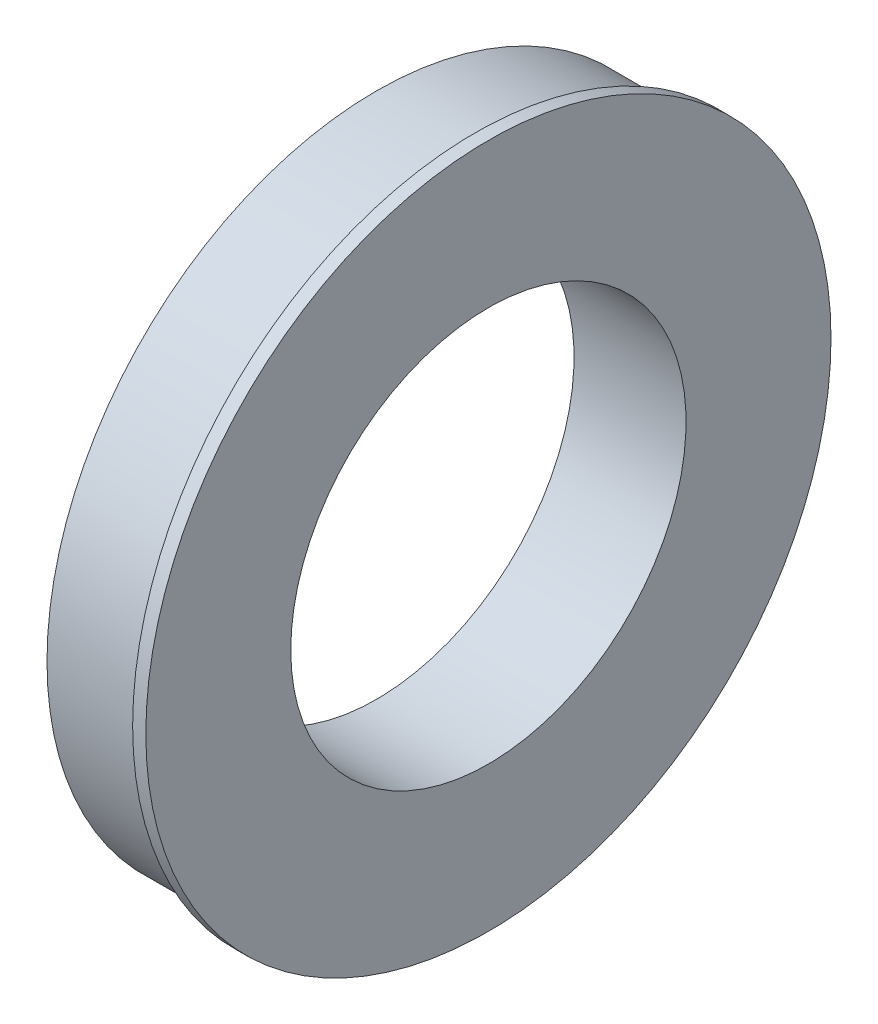
ISO-10303-21;
HEADER;
FILE_DESCRIPTION(('STEP AP214'),'2;1');
FILE_NAME('part.step','',(''),(''),'','','');
FILE_SCHEMA(('AUTOMOTIVE_DESIGN { 1 0 10303 214 1 1 1 1 }'));
ENDSEC;
DATA;
#1=APPLICATION_CONTEXT('core data for automotive mechanical design processes');
#2=APPLICATION_PROTOCOL_DEFINITION('international standard','automotive_design',2000,#1);
#3=PRODUCT_CONTEXT('',#1,'mechanical');
#4=PRODUCT('Part','Part','',(#3));
#5=PRODUCT_RELATED_PRODUCT_CATEGORY('part','',(#4));
#6=PRODUCT_DEFINITION_FORMATION('','',#4);
#7=PRODUCT_DEFINITION_CONTEXT('part definition',#1,'design');
#8=PRODUCT_DEFINITION('design','',#6,#7);
#9=PRODUCT_DEFINITION_SHAPE('','',#8);
#10=(LENGTH_UNIT() NAMED_UNIT(*) SI_UNIT(.MILLI.,.METRE.));
#11=(NAMED_UNIT(*) PLANE_ANGLE_UNIT() SI_UNIT($,.RADIAN.));
#12=(NAMED_UNIT(*) SI_UNIT($,.STERADIAN.) SOLID_ANGLE_UNIT());
#13=UNCERTAINTY_MEASURE_WITH_UNIT(LENGTH_MEASURE(1.E-05),#10,'distance_accuracy_value','');
#14=(GEOMETRIC_REPRESENTATION_CONTEXT(3) GLOBAL_UNCERTAINTY_ASSIGNED_CONTEXT((#13)) GLOBAL_UNIT_ASSIGNED_CONTEXT((#10,
#11,#12)) REPRESENTATION_CONTEXT('',''));
#15=CARTESIAN_POINT('',(0.,0.,0.));
#16=DIRECTION('',(0.,0.,1.));
#17=DIRECTION('',(1.,0.,0.));
#18=AXIS2_PLACEMENT_3D('',#15,#16,#17);
#19=CARTESIAN_POINT('',(5.25485309950739,0.,0.));
#20=DIRECTION('',(1.,0.,0.));
#21=DIRECTION('',(0.,0.,-1.));
#22=AXIS2_PLACEMENT_3D('',#19,#20,#21);
#23=PLANE('',#22);
#24=CARTESIAN_POINT('',(5.25485309950739,0.,0.));
#25=DIRECTION('',(1.,0.,0.));
#26=DIRECTION('',(0.,0.,-1.));
#27=AXIS2_PLACEMENT_3D('',#24,#25,#26);
#28=CIRCLE('',#27,32.98698);
#29=CARTESIAN_POINT('',(5.25485309950739,0.,32.98698));
#30=VERTEX_POINT('',#29);
#31=EDGE_CURVE('E40',#30,#30,#28,.T.);
#32=ORIENTED_EDGE('',*,*,#31,.F.);
#33=EDGE_LOOP('',(#32));
#34=FACE_BOUND('',#33,.T.);
#35=CARTESIAN_POINT('',(5.25485309950739,0.,0.));
#36=DIRECTION('',(1.,0.,0.));
#37=DIRECTION('',(0.,0.,-1.));
#38=AXIS2_PLACEMENT_3D('',#35,#36,#37);
#39=CIRCLE('',#38,19.792188);
#40=CARTESIAN_POINT('',(5.25485309950739,0.,19.792188));
#41=VERTEX_POINT('',#40);
#42=EDGE_CURVE('E49',#41,#41,#39,.T.);
#43=ORIENTED_EDGE('',*,*,#42,.T.);
#44=EDGE_LOOP('',(#43));
#45=FACE_BOUND('',#44,.T.);
#46=ADVANCED_FACE('F36',(#34,#45),#23,.F.);
#47=CARTESIAN_POINT('',(15.1509470995074,0.,0.));
#48=DIRECTION('',(-1.,0.,0.));
#49=DIRECTION('',(0.,0.,1.));
#50=AXIS2_PLACEMENT_3D('',#47,#48,#49);
#51=CYLINDRICAL_SURFACE('',#50,32.98698);
#52=CARTESIAN_POINT('',(15.1509470995074,0.,0.));
#53=DIRECTION('',(1.,0.,0.));
#54=DIRECTION('',(0.,0.,-1.));
#55=AXIS2_PLACEMENT_3D('',#52,#53,#54);
#56=CIRCLE('',#55,32.98698);
#57=CARTESIAN_POINT('',(15.1509470995074,0.,32.98698));
#58=VERTEX_POINT('',#57);
#59=EDGE_CURVE('E10',#58,#58,#56,.T.);
#60=CARTESIAN_POINT('',(15.1509470995074,0.,32.98698));
#61=CARTESIAN_POINT('',(15.0478627870074,0.,32.98698));
#62=CARTESIAN_POINT('',(14.9447784745074,0.,32.98698));
#63=CARTESIAN_POINT('',(14.7386098495074,0.,32.98698));
#64=CARTESIAN_POINT('',(14.6355255370074,0.,32.98698));
#65=CARTESIAN_POINT('',(14.4293569120074,0.,32.98698));
#66=CARTESIAN_POINT('',(14.3262725995074,0.,32.98698));
#67=CARTESIAN_POINT('',(14.1201039745074,0.,32.98698));
#68=CARTESIAN_POINT('',(14.0170196620074,0.,32.98698));
#69=CARTESIAN_POINT('',(13.8108510370074,0.,32.98698));
#70=CARTESIAN_POINT('',(13.7077667245074,0.,32.98698));
#71=CARTESIAN_POINT('',(13.5015980995074,0.,32.98698));
#72=CARTESIAN_POINT('',(13.3985137870074,0.,32.98698));
#73=CARTESIAN_POINT('',(13.1923451620074,0.,32.98698));
#74=CARTESIAN_POINT('',(13.0892608495074,0.,32.98698));
#75=CARTESIAN_POINT('',(12.8830922245074,0.,32.98698));
#76=CARTESIAN_POINT('',(12.7800079120074,0.,32.98698));
#77=CARTESIAN_POINT('',(12.5738392870074,0.,32.98698));
#78=CARTESIAN_POINT('',(12.4707549745074,0.,32.98698));
#79=CARTESIAN_POINT('',(12.2645863495074,0.,32.98698));
#80=CARTESIAN_POINT('',(12.1615020370074,0.,32.98698));
#81=CARTESIAN_POINT('',(11.9553334120074,0.,32.98698));
#82=CARTESIAN_POINT('',(11.8522490995074,0.,32.98698));
#83=CARTESIAN_POINT('',(11.6460804745074,0.,32.98698));
#84=CARTESIAN_POINT('',(11.5429961620074,0.,32.98698));
#85=CARTESIAN_POINT('',(11.3368275370074,0.,32.98698));
#86=CARTESIAN_POINT('',(11.2337432245074,0.,32.98698));
#87=CARTESIAN_POINT('',(11.0275745995074,0.,32.98698));
#88=CARTESIAN_POINT('',(10.9244902870074,0.,32.98698));
#89=CARTESIAN_POINT('',(10.7183216620074,0.,32.98698));
#90=CARTESIAN_POINT('',(10.6152373495074,0.,32.98698));
#91=CARTESIAN_POINT('',(10.4090687245074,0.,32.98698));
#92=CARTESIAN_POINT('',(10.3059844120074,0.,32.98698));
#93=CARTESIAN_POINT('',(10.0998157870074,0.,32.98698));
#94=CARTESIAN_POINT('',(9.99673147450739,0.,32.98698));
#95=CARTESIAN_POINT('',(9.79056284950739,0.,32.98698));
#96=CARTESIAN_POINT('',(9.68747853700739,0.,32.98698));
#97=CARTESIAN_POINT('',(9.48130991200739,0.,32.98698));
#98=CARTESIAN_POINT('',(9.37822559950739,0.,32.98698));
#99=CARTESIAN_POINT('',(9.17205697450739,0.,32.98698));
#100=CARTESIAN_POINT('',(9.06897266200739,0.,32.98698));
#101=CARTESIAN_POINT('',(8.86280403700739,0.,32.98698));
#102=CARTESIAN_POINT('',(8.75971972450739,0.,32.98698));
#103=CARTESIAN_POINT('',(8.55355109950739,0.,32.98698));
#104=CARTESIAN_POINT('',(8.45046678700739,0.,32.98698));
#105=CARTESIAN_POINT('',(8.24429816200739,0.,32.98698));
#106=CARTESIAN_POINT('',(8.14121384950739,0.,32.98698));
#107=CARTESIAN_POINT('',(7.93504522450739,0.,32.98698));
#108=CARTESIAN_POINT('',(7.83196091200739,0.,32.98698));
#109=CARTESIAN_POINT('',(7.62579228700739,0.,32.98698));
#110=CARTESIAN_POINT('',(7.52270797450739,0.,32.98698));
#111=CARTESIAN_POINT('',(7.31653934950739,0.,32.98698));
#112=CARTESIAN_POINT('',(7.21345503700739,0.,32.98698));
#113=CARTESIAN_POINT('',(7.00728641200739,0.,32.98698));
#114=CARTESIAN_POINT('',(6.90420209950739,0.,32.98698));
#115=CARTESIAN_POINT('',(6.69803347450739,0.,32.98698));
#116=CARTESIAN_POINT('',(6.59494916200739,0.,32.98698));
#117=CARTESIAN_POINT('',(6.38878053700739,0.,32.98698));
#118=CARTESIAN_POINT('',(6.28569622450739,0.,32.98698));
#119=CARTESIAN_POINT('',(6.07952759950739,0.,32.98698));
#120=CARTESIAN_POINT('',(5.97644328700739,0.,32.98698));
#121=CARTESIAN_POINT('',(5.77027466200739,0.,32.98698));
#122=CARTESIAN_POINT('',(5.66719034950739,0.,32.98698));
#123=CARTESIAN_POINT('',(5.46102172450739,0.,32.98698));
#124=CARTESIAN_POINT('',(5.35793741200739,0.,32.98698));
#125=CARTESIAN_POINT('',(5.25485309950739,0.,32.98698));
#126=B_SPLINE_CURVE_WITH_KNOTS('',3,(#60,#61,#62,#63,#64,#65,#66,#67,#68,#69,#70,#71,#72,#73,
#74,#75,#76,#77,#78,#79,#80,#81,#82,#83,#84,#85,#86,#87,#88,#89,#90,#91,#92,#93,#94,#95,#96,#97,
#98,#99,#100,#101,#102,#103,#104,#105,#106,#107,#108,#109,#110,#111,#112,#113,#114,#115,#116,
#117,#118,#119,#120,#121,#122,#123,#124,#125),.UNSPECIFIED.,.F.,.F.,(4,2,2,2,2,2,2,2,2,2,2,2,2,
2,2,2,2,2,2,2,2,2,2,2,2,2,2,2,2,2,2,2,4),(0.,0.309252937500001,0.618505875000001,
0.927758812500002,1.23701175,1.5462646875,1.855517625,2.1647705625,2.4740235,2.7832764375,
3.092529375,3.4017823125,3.71103525,4.0202881875,4.329541125,4.6387940625,4.948047,5.2572999375,
5.566552875,5.8758058125,6.18505875,6.4943116875,6.803564625,7.1128175625,7.4220705,
7.7313234375,8.040576375,8.3498293125,8.65908225,8.9683351875,9.277588125,9.5868410625,
9.896094),.UNSPECIFIED.);
#127=EDGE_CURVE('BSEAM38',#58,#30,#126,.T.);
#128=ORIENTED_EDGE('',*,*,#59,.F.);
#129=ORIENTED_EDGE('',*,*,#31,.T.);
#130=ORIENTED_EDGE('',*,*,#127,.T.);
#131=ORIENTED_EDGE('',*,*,#127,.F.);
#132=EDGE_LOOP('',(#128,#130,#129,#131));
#133=FACE_BOUND('',#132,.T.);
#134=ADVANCED_FACE('F38',(#133),#51,.T.);
#135=CARTESIAN_POINT('',(15.1509470995074,0.,0.));
#136=DIRECTION('',(-1.,0.,0.));
#137=DIRECTION('',(0.,0.,1.));
#138=AXIS2_PLACEMENT_3D('',#135,#136,#137);
#139=CYLINDRICAL_SURFACE('',#138,19.792188);
#140=CARTESIAN_POINT('',(16.4704262995074,0.,0.));
#141=DIRECTION('',(1.,0.,0.));
#142=DIRECTION('',(0.,0.,-1.));
#143=AXIS2_PLACEMENT_3D('',#140,#141,#142);
#144=CIRCLE('',#143,19.792188);
#145=CARTESIAN_POINT('',(16.4704262995074,0.,19.792188));
#146=VERTEX_POINT('',#145);
#147=EDGE_CURVE('E59',#146,#146,#144,.T.);
#148=CARTESIAN_POINT('',(5.25485309950739,0.,19.792188));
#149=CARTESIAN_POINT('',(5.37168198700739,0.,19.792188));
#150=CARTESIAN_POINT('',(5.48851087450739,0.,19.792188));
#151=CARTESIAN_POINT('',(5.72216864950739,0.,19.792188));
#152=CARTESIAN_POINT('',(5.83899753700739,0.,19.792188));
#153=CARTESIAN_POINT('',(6.07265531200739,0.,19.792188));
#154=CARTESIAN_POINT('',(6.18948419950739,0.,19.792188));
#155=CARTESIAN_POINT('',(6.42314197450739,0.,19.792188));
#156=CARTESIAN_POINT('',(6.53997086200739,0.,19.792188));
#157=CARTESIAN_POINT('',(6.77362863700739,0.,19.792188));
#158=CARTESIAN_POINT('',(6.89045752450739,0.,19.792188));
#159=CARTESIAN_POINT('',(7.12411529950739,0.,19.792188));
#160=CARTESIAN_POINT('',(7.24094418700739,0.,19.792188));
#161=CARTESIAN_POINT('',(7.47460196200739,0.,19.792188));
#162=CARTESIAN_POINT('',(7.59143084950739,0.,19.792188));
#163=CARTESIAN_POINT('',(7.82508862450739,0.,19.792188));
#164=CARTESIAN_POINT('',(7.94191751200739,0.,19.792188));
#165=CARTESIAN_POINT('',(8.17557528700739,0.,19.792188));
#166=CARTESIAN_POINT('',(8.29240417450739,0.,19.792188));
#167=CARTESIAN_POINT('',(8.52606194950739,0.,19.792188));
#168=CARTESIAN_POINT('',(8.64289083700739,0.,19.792188));
#169=CARTESIAN_POINT('',(8.87654861200739,0.,19.792188));
#170=CARTESIAN_POINT('',(8.99337749950739,0.,19.792188));
#171=CARTESIAN_POINT('',(9.22703527450739,0.,19.792188));
#172=CARTESIAN_POINT('',(9.34386416200739,0.,19.792188));
#173=CARTESIAN_POINT('',(9.57752193700739,0.,19.792188));
#174=CARTESIAN_POINT('',(9.69435082450739,0.,19.792188));
#175=CARTESIAN_POINT('',(9.92800859950739,0.,19.792188));
#176=CARTESIAN_POINT('',(10.0448374870074,0.,19.792188));
#177=CARTESIAN_POINT('',(10.2784952620074,0.,19.792188));
#178=CARTESIAN_POINT('',(10.3953241495074,0.,19.792188));
#179=CARTESIAN_POINT('',(10.6289819245074,0.,19.792188));
#180=CARTESIAN_POINT('',(10.7458108120074,0.,19.792188));
#181=CARTESIAN_POINT('',(10.9794685870074,0.,19.792188));
#182=CARTESIAN_POINT('',(11.0962974745074,0.,19.792188));
#183=CARTESIAN_POINT('',(11.3299552495074,0.,19.792188));
#184=CARTESIAN_POINT('',(11.4467841370074,0.,19.792188));
#185=CARTESIAN_POINT('',(11.6804419120074,0.,19.792188));
#186=CARTESIAN_POINT('',(11.7972707995074,0.,19.792188));
#187=CARTESIAN_POINT('',(12.0309285745074,0.,19.792188));
#188=CARTESIAN_POINT('',(12.1477574620074,0.,19.792188));
#189=CARTESIAN_POINT('',(12.3814152370074,0.,19.792188));
#190=CARTESIAN_POINT('',(12.4982441245074,0.,19.792188));
#191=CARTESIAN_POINT('',(12.7319018995074,0.,19.792188));
#192=CARTESIAN_POINT('',(12.8487307870074,0.,19.792188));
#193=CARTESIAN_POINT('',(13.0823885620074,0.,19.792188));
#194=CARTESIAN_POINT('',(13.1992174495074,0.,19.792188));
#195=CARTESIAN_POINT('',(13.4328752245074,0.,19.792188));
#196=CARTESIAN_POINT('',(13.5497041120074,0.,19.792188));
#197=CARTESIAN_POINT('',(13.7833618870074,0.,19.792188));
#198=CARTESIAN_POINT('',(13.9001907745074,0.,19.792188));
#199=CARTESIAN_POINT('',(14.1338485495074,0.,19.792188));
#200=CARTESIAN_POINT('',(14.2506774370074,0.,19.792188));
#201=CARTESIAN_POINT('',(14.4843352120074,0.,19.792188));
#202=CARTESIAN_POINT('',(14.6011640995074,0.,19.792188));
#203=CARTESIAN_POINT('',(14.8348218745074,0.,19.792188));
#204=CARTESIAN_POINT('',(14.9516507620074,0.,19.792188));
#205=CARTESIAN_POINT('',(15.1853085370074,0.,19.792188));
#206=CARTESIAN_POINT('',(15.3021374245074,0.,19.792188));
#207=CARTESIAN_POINT('',(15.5357951995074,0.,19.792188));
#208=CARTESIAN_POINT('',(15.6526240870074,0.,19.792188));
#209=CARTESIAN_POINT('',(15.8862818620074,0.,19.792188));
#210=CARTESIAN_POINT('',(16.0031107495074,0.,19.792188));
#211=CARTESIAN_POINT('',(16.2367685245074,0.,19.792188));
#212=CARTESIAN_POINT('',(16.3535974120074,0.,19.792188));
#213=CARTESIAN_POINT('',(16.4704262995074,0.,19.792188));
#214=B_SPLINE_CURVE_WITH_KNOTS('',3,(#148,#149,#150,#151,#152,#153,#154,#155,#156,#157,#158,
#159,#160,#161,#162,#163,#164,#165,#166,#167,#168,#169,#170,#171,#172,#173,#174,#175,#176,#177,
#178,#179,#180,#181,#182,#183,#184,#185,#186,#187,#188,#189,#190,#191,#192,#193,#194,#195,#196,
#197,#198,#199,#200,#201,#202,#203,#204,#205,#206,#207,#208,#209,#210,#211,#212,#213),
.UNSPECIFIED.,.F.,.F.,(4,2,2,2,2,2,2,2,2,2,2,2,2,2,2,2,2,2,2,2,2,2,2,2,2,2,2,2,2,2,2,2,4),(0.,
0.3504866625,0.700973325,1.0514599875,1.40194665,1.7524333125,2.102919975,2.4534066375,
2.8038933,3.1543799625,3.504866625,3.8553532875,4.20583995,4.5563266125,4.906813275,
5.2572999375,5.6077866,5.9582732625,6.308759925,6.6592465875,7.00973325,7.3602199125,
7.710706575,8.0611932375,8.4116799,8.7621665625,9.112653225,9.4631398875,9.81362655,
10.1641132125,10.514599875,10.8650865375,11.2155732),.UNSPECIFIED.);
#215=EDGE_CURVE('BSEAM67',#41,#146,#214,.T.);
#216=ORIENTED_EDGE('',*,*,#42,.F.);
#217=ORIENTED_EDGE('',*,*,#147,.T.);
#218=ORIENTED_EDGE('',*,*,#215,.T.);
#219=ORIENTED_EDGE('',*,*,#215,.F.);
#220=EDGE_LOOP('',(#216,#218,#217,#219));
#221=FACE_BOUND('',#220,.T.);
#222=ADVANCED_FACE('F67',(#221),#139,.F.);
#223=CARTESIAN_POINT('',(16.4704262995074,0.,0.));
#224=DIRECTION('',(1.,0.,0.));
#225=DIRECTION('',(0.,0.,-1.));
#226=AXIS2_PLACEMENT_3D('',#223,#224,#225);
#227=PLANE('',#226);
#228=CARTESIAN_POINT('',(16.4704262995074,0.,0.));
#229=DIRECTION('',(1.,0.,0.));
#230=DIRECTION('',(0.,0.,-1.));
#231=AXIS2_PLACEMENT_3D('',#228,#229,#230);
#232=CIRCLE('',#231,34.3064592);
#233=CARTESIAN_POINT('',(16.4704262995074,0.,-34.3064592));
#234=VERTEX_POINT('',#233);
#235=EDGE_CURVE('E54',#234,#234,#232,.T.);
#236=ORIENTED_EDGE('',*,*,#235,.T.);
#237=EDGE_LOOP('',(#236));
#238=FACE_BOUND('',#237,.T.);
#239=ORIENTED_EDGE('',*,*,#147,.F.);
#240=EDGE_LOOP('',(#239));
#241=FACE_BOUND('',#240,.T.);
#242=ADVANCED_FACE('F69',(#238,#241),#227,.T.);
#243=CARTESIAN_POINT('',(15.1509470995074,0.,0.));
#244=DIRECTION('',(1.,0.,0.));
#245=DIRECTION('',(0.,0.,-1.));
#246=AXIS2_PLACEMENT_3D('',#243,#244,#245);
#247=PLANE('',#246);
#248=ORIENTED_EDGE('',*,*,#59,.T.);
#249=EDGE_LOOP('',(#248));
#250=FACE_BOUND('',#249,.T.);
#251=CARTESIAN_POINT('',(15.1509470995074,0.,0.));
#252=DIRECTION('',(1.,0.,0.));
#253=DIRECTION('',(0.,0.,-1.));
#254=AXIS2_PLACEMENT_3D('',#251,#252,#253);
#255=CIRCLE('',#254,34.3064592);
#256=CARTESIAN_POINT('',(15.1509470995074,0.,-34.3064592));
#257=VERTEX_POINT('',#256);
#258=EDGE_CURVE('E55',#257,#257,#255,.T.);
#259=ORIENTED_EDGE('',*,*,#258,.F.);
#260=EDGE_LOOP('',(#259));
#261=FACE_BOUND('',#260,.T.);
#262=ADVANCED_FACE('F71',(#250,#261),#247,.F.);
#263=CARTESIAN_POINT('',(16.4704262995074,0.,0.));
#264=DIRECTION('',(-1.,0.,0.));
#265=DIRECTION('',(0.,0.,1.));
#266=AXIS2_PLACEMENT_3D('',#263,#264,#265);
#267=CYLINDRICAL_SURFACE('',#266,34.3064592);
#268=ORIENTED_EDGE('',*,*,#235,.F.);
#269=EDGE_LOOP('',(#268));
#270=FACE_BOUND('',#269,.T.);
#271=ORIENTED_EDGE('',*,*,#258,.T.);
#272=EDGE_LOOP('',(#271));
#273=FACE_BOUND('',#272,.T.);
#274=ADVANCED_FACE('F78',(#270,#273),#267,.T.);
#275=CLOSED_SHELL('',(#46,#134,#222,#242,#262,#274));
#276=MANIFOLD_SOLID_BREP('B2',#275);
#277=ADVANCED_BREP_SHAPE_REPRESENTATION('',(#18,#276),#14);
#278=SHAPE_DEFINITION_REPRESENTATION(#9,#277);
ENDSEC;
END-ISO-10303-21;
